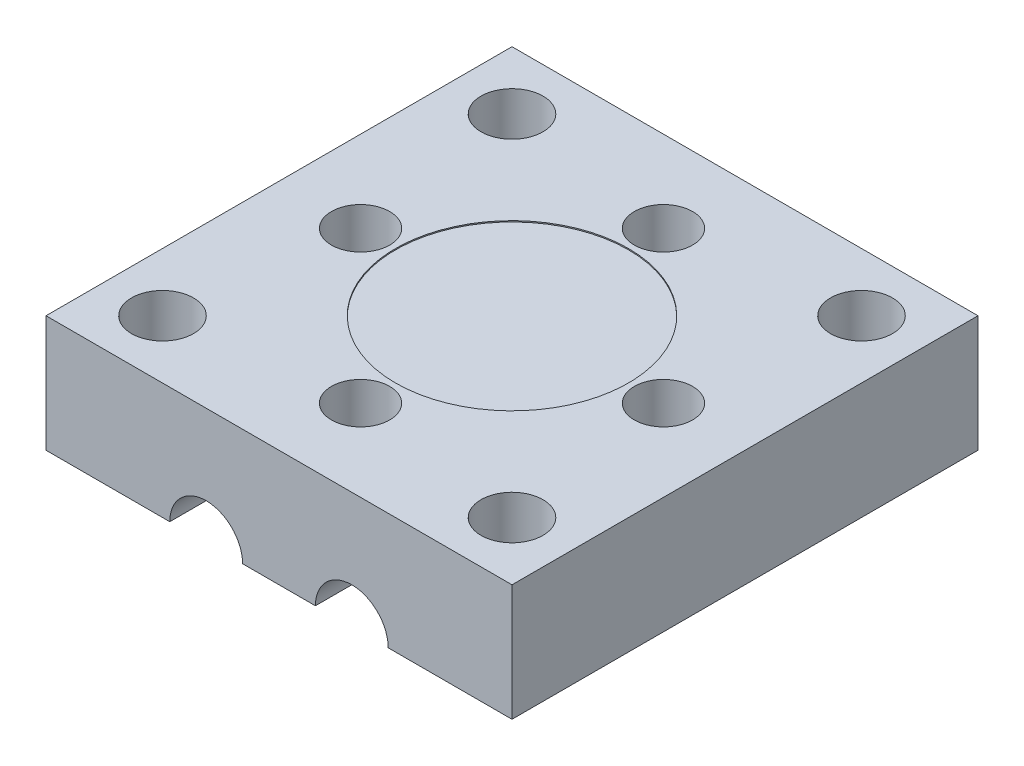
ISO-10303-21;
HEADER;
FILE_DESCRIPTION(('STEP AP214'),'2;1');
FILE_NAME('part.step','',(''),(''),'','','');
FILE_SCHEMA(('AUTOMOTIVE_DESIGN { 1 0 10303 214 1 1 1 1 }'));
ENDSEC;
DATA;
#1=APPLICATION_CONTEXT('core data for automotive mechanical design processes');
#2=APPLICATION_PROTOCOL_DEFINITION('international standard','automotive_design',2000,#1);
#3=PRODUCT_CONTEXT('',#1,'mechanical');
#4=PRODUCT('Part','Part','',(#3));
#5=PRODUCT_RELATED_PRODUCT_CATEGORY('part','',(#4));
#6=PRODUCT_DEFINITION_FORMATION('','',#4);
#7=PRODUCT_DEFINITION_CONTEXT('part definition',#1,'design');
#8=PRODUCT_DEFINITION('design','',#6,#7);
#9=PRODUCT_DEFINITION_SHAPE('','',#8);
#10=(LENGTH_UNIT() NAMED_UNIT(*) SI_UNIT(.MILLI.,.METRE.));
#11=(NAMED_UNIT(*) PLANE_ANGLE_UNIT() SI_UNIT($,.RADIAN.));
#12=(NAMED_UNIT(*) SI_UNIT($,.STERADIAN.) SOLID_ANGLE_UNIT());
#13=UNCERTAINTY_MEASURE_WITH_UNIT(LENGTH_MEASURE(1.E-05),#10,'distance_accuracy_value','');
#14=(GEOMETRIC_REPRESENTATION_CONTEXT(3) GLOBAL_UNCERTAINTY_ASSIGNED_CONTEXT((#13)) GLOBAL_UNIT_ASSIGNED_CONTEXT((#10,
#11,#12)) REPRESENTATION_CONTEXT('',''));
#15=CARTESIAN_POINT('',(0.,0.,0.));
#16=DIRECTION('',(0.,0.,1.));
#17=DIRECTION('',(1.,0.,0.));
#18=AXIS2_PLACEMENT_3D('',#15,#16,#17);
#19=CARTESIAN_POINT('',(-16.51,6.35,0.));
#20=DIRECTION('',(0.,1.,0.));
#21=DIRECTION('',(0.,0.,1.));
#22=AXIS2_PLACEMENT_3D('',#19,#20,#21);
#23=CYLINDRICAL_SURFACE('',#22,1.89865);
#24=CARTESIAN_POINT('',(-16.51,6.35,0.));
#25=DIRECTION('',(0.,1.,0.));
#26=DIRECTION('',(0.,0.,1.));
#27=AXIS2_PLACEMENT_3D('',#24,#25,#26);
#28=CIRCLE('',#27,1.89865);
#29=CARTESIAN_POINT('',(-16.51,6.35,1.89865));
#30=VERTEX_POINT('',#29);
#31=EDGE_CURVE('E157',#30,#30,#28,.T.);
#32=ORIENTED_EDGE('',*,*,#31,.T.);
#33=EDGE_LOOP('',(#32));
#34=FACE_BOUND('',#33,.T.);
#35=CARTESIAN_POINT('',(-16.51,1.5875,0.));
#36=DIRECTION('',(0.,-1.,0.));
#37=DIRECTION('',(0.,0.,-1.));
#38=AXIS2_PLACEMENT_3D('',#35,#36,#37);
#39=CIRCLE('',#38,1.89865);
#40=CARTESIAN_POINT('',(-16.51,1.5875,-1.89865));
#41=VERTEX_POINT('',#40);
#42=EDGE_CURVE('E38',#41,#41,#39,.F.);
#43=ORIENTED_EDGE('',*,*,#42,.F.);
#44=EDGE_LOOP('',(#43));
#45=FACE_BOUND('',#44,.T.);
#46=ADVANCED_FACE('F34',(#34,#45),#23,.F.);
#47=CARTESIAN_POINT('',(0.,6.35,-16.51));
#48=DIRECTION('',(0.,1.,0.));
#49=DIRECTION('',(0.,0.,1.));
#50=AXIS2_PLACEMENT_3D('',#47,#48,#49);
#51=CYLINDRICAL_SURFACE('',#50,1.89865);
#52=CARTESIAN_POINT('',(0.,6.35,-16.51));
#53=DIRECTION('',(0.,1.,0.));
#54=DIRECTION('',(0.,0.,1.));
#55=AXIS2_PLACEMENT_3D('',#52,#53,#54);
#56=CIRCLE('',#55,1.89865);
#57=CARTESIAN_POINT('',(0.,6.35,-14.61135));
#58=VERTEX_POINT('',#57);
#59=EDGE_CURVE('E190',#58,#58,#56,.T.);
#60=ORIENTED_EDGE('',*,*,#59,.T.);
#61=EDGE_LOOP('',(#60));
#62=FACE_BOUND('',#61,.T.);
#63=CARTESIAN_POINT('',(0.,1.5875,-16.51));
#64=DIRECTION('',(0.,-1.,0.));
#65=DIRECTION('',(0.,0.,-1.));
#66=AXIS2_PLACEMENT_3D('',#63,#64,#65);
#67=CIRCLE('',#66,1.89865);
#68=CARTESIAN_POINT('',(0.,1.5875,-18.40865));
#69=VERTEX_POINT('',#68);
#70=EDGE_CURVE('E163',#69,#69,#67,.F.);
#71=ORIENTED_EDGE('',*,*,#70,.F.);
#72=EDGE_LOOP('',(#71));
#73=FACE_BOUND('',#72,.T.);
#74=ADVANCED_FACE('F290',(#62,#73),#51,.F.);
#75=CARTESIAN_POINT('',(16.51,6.35,0.));
#76=DIRECTION('',(0.,1.,0.));
#77=DIRECTION('',(0.,0.,1.));
#78=AXIS2_PLACEMENT_3D('',#75,#76,#77);
#79=CYLINDRICAL_SURFACE('',#78,1.89865);
#80=CARTESIAN_POINT('',(16.51,6.35,0.));
#81=DIRECTION('',(0.,1.,0.));
#82=DIRECTION('',(0.,0.,1.));
#83=AXIS2_PLACEMENT_3D('',#80,#81,#82);
#84=CIRCLE('',#83,1.89865);
#85=CARTESIAN_POINT('',(16.51,6.35,1.89865));
#86=VERTEX_POINT('',#85);
#87=EDGE_CURVE('E193',#86,#86,#84,.T.);
#88=ORIENTED_EDGE('',*,*,#87,.T.);
#89=EDGE_LOOP('',(#88));
#90=FACE_BOUND('',#89,.T.);
#91=CARTESIAN_POINT('',(16.51,1.5875,0.));
#92=DIRECTION('',(0.,-1.,0.));
#93=DIRECTION('',(0.,0.,-1.));
#94=AXIS2_PLACEMENT_3D('',#91,#92,#93);
#95=CIRCLE('',#94,1.89865);
#96=CARTESIAN_POINT('',(16.51,1.5875,-1.89865));
#97=VERTEX_POINT('',#96);
#98=EDGE_CURVE('E159',#97,#97,#95,.F.);
#99=ORIENTED_EDGE('',*,*,#98,.F.);
#100=EDGE_LOOP('',(#99));
#101=FACE_BOUND('',#100,.T.);
#102=ADVANCED_FACE('F296',(#90,#101),#79,.F.);
#103=CARTESIAN_POINT('',(0.,6.35,16.51));
#104=DIRECTION('',(0.,1.,0.));
#105=DIRECTION('',(0.,0.,1.));
#106=AXIS2_PLACEMENT_3D('',#103,#104,#105);
#107=CYLINDRICAL_SURFACE('',#106,1.89865);
#108=CARTESIAN_POINT('',(0.,6.35,16.51));
#109=DIRECTION('',(0.,1.,0.));
#110=DIRECTION('',(0.,0.,1.));
#111=AXIS2_PLACEMENT_3D('',#108,#109,#110);
#112=CIRCLE('',#111,1.89865);
#113=CARTESIAN_POINT('',(0.,6.35,18.40865));
#114=VERTEX_POINT('',#113);
#115=EDGE_CURVE('E196',#114,#114,#112,.T.);
#116=ORIENTED_EDGE('',*,*,#115,.T.);
#117=EDGE_LOOP('',(#116));
#118=FACE_BOUND('',#117,.T.);
#119=CARTESIAN_POINT('',(0.,1.5875,16.51));
#120=DIRECTION('',(0.,-1.,0.));
#121=DIRECTION('',(0.,0.,-1.));
#122=AXIS2_PLACEMENT_3D('',#119,#120,#121);
#123=CIRCLE('',#122,1.89865);
#124=CARTESIAN_POINT('',(0.,1.5875,14.61135));
#125=VERTEX_POINT('',#124);
#126=EDGE_CURVE('E154',#125,#125,#123,.F.);
#127=ORIENTED_EDGE('',*,*,#126,.F.);
#128=EDGE_LOOP('',(#127));
#129=FACE_BOUND('',#128,.T.);
#130=ADVANCED_FACE('F281',(#118,#129),#107,.F.);
#131=CARTESIAN_POINT('',(0.,0.,0.));
#132=DIRECTION('',(0.,1.,0.));
#133=DIRECTION('',(0.,0.,1.));
#134=AXIS2_PLACEMENT_3D('',#131,#132,#133);
#135=PLANE('',#134);
#136=CARTESIAN_POINT('',(0.,0.,-16.51));
#137=DIRECTION('',(0.,-1.,0.));
#138=DIRECTION('',(0.,0.,-1.));
#139=AXIS2_PLACEMENT_3D('',#136,#137,#138);
#140=CIRCLE('',#139,3.175);
#141=CARTESIAN_POINT('',(0.,0.,-19.685));
#142=VERTEX_POINT('',#141);
#143=EDGE_CURVE('E172',#142,#142,#140,.T.);
#144=ORIENTED_EDGE('',*,*,#143,.F.);
#145=EDGE_LOOP('',(#144));
#146=FACE_BOUND('',#145,.T.);
#147=CARTESIAN_POINT('',(0.,0.,16.51));
#148=DIRECTION('',(0.,-1.,0.));
#149=DIRECTION('',(0.,0.,-1.));
#150=AXIS2_PLACEMENT_3D('',#147,#148,#149);
#151=CIRCLE('',#150,3.175);
#152=CARTESIAN_POINT('',(0.,0.,13.335));
#153=VERTEX_POINT('',#152);
#154=EDGE_CURVE('E161',#153,#153,#151,.T.);
#155=ORIENTED_EDGE('',*,*,#154,.F.);
#156=EDGE_LOOP('',(#155));
#157=FACE_BOUND('',#156,.T.);
#158=DIRECTION('',(-1.,0.,0.));
#159=VECTOR('',#158,1.);
#160=CARTESIAN_POINT('',(-25.4,0.,-25.4));
#161=LINE('',#160,#159);
#162=CARTESIAN_POINT('',(3.96875,0.,-25.4));
#163=VERTEX_POINT('',#162);
#164=CARTESIAN_POINT('',(-3.96875,0.,-25.4));
#165=VERTEX_POINT('',#164);
#166=EDGE_CURVE('E58',#163,#165,#161,.T.);
#167=ORIENTED_EDGE('',*,*,#166,.F.);
#168=DIRECTION('',(0.,0.,1.));
#169=VECTOR('',#168,1.);
#170=CARTESIAN_POINT('',(3.96875,0.,-25.4));
#171=LINE('',#170,#169);
#172=CARTESIAN_POINT('',(3.96875,0.,25.4));
#173=VERTEX_POINT('',#172);
#174=EDGE_CURVE('E11',#163,#173,#171,.T.);
#175=ORIENTED_EDGE('',*,*,#174,.T.);
#176=DIRECTION('',(1.,0.,0.));
#177=VECTOR('',#176,1.);
#178=CARTESIAN_POINT('',(-25.4,0.,25.4));
#179=LINE('',#178,#177);
#180=CARTESIAN_POINT('',(-3.96875,0.,25.4));
#181=VERTEX_POINT('',#180);
#182=EDGE_CURVE('E116',#181,#173,#179,.T.);
#183=ORIENTED_EDGE('',*,*,#182,.F.);
#184=DIRECTION('',(0.,0.,1.));
#185=VECTOR('',#184,1.);
#186=CARTESIAN_POINT('',(-3.96875,0.,-25.4));
#187=LINE('',#186,#185);
#188=EDGE_CURVE('E149',#181,#165,#187,.F.);
#189=ORIENTED_EDGE('',*,*,#188,.T.);
#190=EDGE_LOOP('',(#167,#175,#183,#189));
#191=FACE_BOUND('',#190,.T.);
#192=ADVANCED_FACE('F269',(#146,#157,#191),#135,.F.);
#193=CARTESIAN_POINT('',(-16.51,0.,0.));
#194=DIRECTION('',(0.,-1.,0.));
#195=DIRECTION('',(0.,0.,-1.));
#196=AXIS2_PLACEMENT_3D('',#193,#194,#195);
#197=CIRCLE('',#196,3.175);
#198=CARTESIAN_POINT('',(-16.51,0.,-3.175));
#199=VERTEX_POINT('',#198);
#200=EDGE_CURVE('E179',#199,#199,#197,.T.);
#201=ORIENTED_EDGE('',*,*,#200,.F.);
#202=EDGE_LOOP('',(#201));
#203=FACE_BOUND('',#202,.T.);
#204=CARTESIAN_POINT('',(-19.05,0.,19.05));
#205=DIRECTION('',(0.,1.,0.));
#206=DIRECTION('',(0.,0.,1.));
#207=AXIS2_PLACEMENT_3D('',#204,#205,#206);
#208=CIRCLE('',#207,3.37819999999999);
#209=CARTESIAN_POINT('',(-19.05,0.,22.4282));
#210=VERTEX_POINT('',#209);
#211=EDGE_CURVE('E226',#210,#210,#208,.T.);
#212=ORIENTED_EDGE('',*,*,#211,.T.);
#213=EDGE_LOOP('',(#212));
#214=FACE_BOUND('',#213,.T.);
#215=CARTESIAN_POINT('',(-19.05,0.,-19.05));
#216=DIRECTION('',(0.,1.,0.));
#217=DIRECTION('',(0.,0.,1.));
#218=AXIS2_PLACEMENT_3D('',#215,#216,#217);
#219=CIRCLE('',#218,3.37819999999999);
#220=CARTESIAN_POINT('',(-19.05,0.,-15.6718));
#221=VERTEX_POINT('',#220);
#222=EDGE_CURVE('E232',#221,#221,#219,.T.);
#223=ORIENTED_EDGE('',*,*,#222,.T.);
#224=EDGE_LOOP('',(#223));
#225=FACE_BOUND('',#224,.T.);
#226=CARTESIAN_POINT('',(-11.90625,0.,-25.4));
#227=VERTEX_POINT('',#226);
#228=CARTESIAN_POINT('',(-25.4,0.,-25.4));
#229=VERTEX_POINT('',#228);
#230=EDGE_CURVE('E131',#227,#229,#161,.T.);
#231=ORIENTED_EDGE('',*,*,#230,.F.);
#232=DIRECTION('',(0.,0.,1.));
#233=VECTOR('',#232,1.);
#234=CARTESIAN_POINT('',(-11.90625,0.,-25.4));
#235=LINE('',#234,#233);
#236=CARTESIAN_POINT('',(-11.90625,0.,25.4));
#237=VERTEX_POINT('',#236);
#238=EDGE_CURVE('E106',#227,#237,#235,.T.);
#239=ORIENTED_EDGE('',*,*,#238,.T.);
#240=CARTESIAN_POINT('',(-25.4,0.,25.4));
#241=VERTEX_POINT('',#240);
#242=EDGE_CURVE('E124',#241,#237,#179,.T.);
#243=ORIENTED_EDGE('',*,*,#242,.F.);
#244=DIRECTION('',(0.,0.,1.));
#245=VECTOR('',#244,1.);
#246=CARTESIAN_POINT('',(-25.4,0.,-25.4));
#247=LINE('',#246,#245);
#248=EDGE_CURVE('E122',#229,#241,#247,.T.);
#249=ORIENTED_EDGE('',*,*,#248,.F.);
#250=EDGE_LOOP('',(#231,#239,#243,#249));
#251=FACE_BOUND('',#250,.T.);
#252=ADVANCED_FACE('F273',(#203,#214,#225,#251),#135,.F.);
#253=CARTESIAN_POINT('',(-25.4,12.7,-25.4));
#254=DIRECTION('',(1.,0.,0.));
#255=DIRECTION('',(0.,0.,-1.));
#256=AXIS2_PLACEMENT_3D('',#253,#254,#255);
#257=PLANE('',#256);
#258=ORIENTED_EDGE('',*,*,#248,.T.);
#259=DIRECTION('',(0.,-1.,0.));
#260=VECTOR('',#259,1.);
#261=CARTESIAN_POINT('',(-25.4,12.7,25.4));
#262=LINE('',#261,#260);
#263=CARTESIAN_POINT('',(-25.4,12.7,25.4));
#264=VERTEX_POINT('',#263);
#265=EDGE_CURVE('E147',#264,#241,#262,.T.);
#266=ORIENTED_EDGE('',*,*,#265,.F.);
#267=DIRECTION('',(0.,0.,1.));
#268=VECTOR('',#267,1.);
#269=CARTESIAN_POINT('',(-25.4,12.7,-25.4));
#270=LINE('',#269,#268);
#271=CARTESIAN_POINT('',(-25.4,12.7,-25.4));
#272=VERTEX_POINT('',#271);
#273=EDGE_CURVE('E138',#272,#264,#270,.T.);
#274=ORIENTED_EDGE('',*,*,#273,.F.);
#275=DIRECTION('',(0.,-1.,0.));
#276=VECTOR('',#275,1.);
#277=CARTESIAN_POINT('',(-25.4,12.7,-25.4));
#278=LINE('',#277,#276);
#279=EDGE_CURVE('E139',#272,#229,#278,.T.);
#280=ORIENTED_EDGE('',*,*,#279,.T.);
#281=EDGE_LOOP('',(#258,#266,#274,#280));
#282=FACE_BOUND('',#281,.T.);
#283=ADVANCED_FACE('F36',(#282),#257,.F.);
#284=CARTESIAN_POINT('',(-25.4,12.7,25.4));
#285=DIRECTION('',(0.,0.,-1.));
#286=DIRECTION('',(-1.,0.,0.));
#287=AXIS2_PLACEMENT_3D('',#284,#285,#286);
#288=PLANE('',#287);
#289=ORIENTED_EDGE('',*,*,#182,.T.);
#290=CARTESIAN_POINT('',(7.9375,0.,25.4));
#291=DIRECTION('',(0.,0.,1.));
#292=DIRECTION('',(1.,0.,0.));
#293=AXIS2_PLACEMENT_3D('',#290,#291,#292);
#294=CIRCLE('',#293,3.96875);
#295=CARTESIAN_POINT('',(11.90625,0.,25.4));
#296=VERTEX_POINT('',#295);
#297=EDGE_CURVE('E101',#296,#173,#294,.T.);
#298=ORIENTED_EDGE('',*,*,#297,.F.);
#299=CARTESIAN_POINT('',(25.4,0.,25.4));
#300=VERTEX_POINT('',#299);
#301=EDGE_CURVE('E112',#296,#300,#179,.T.);
#302=ORIENTED_EDGE('',*,*,#301,.T.);
#303=DIRECTION('',(0.,-1.,0.));
#304=VECTOR('',#303,1.);
#305=CARTESIAN_POINT('',(25.4,12.7,25.4));
#306=LINE('',#305,#304);
#307=CARTESIAN_POINT('',(25.4,12.7,25.4));
#308=VERTEX_POINT('',#307);
#309=EDGE_CURVE('E145',#308,#300,#306,.T.);
#310=ORIENTED_EDGE('',*,*,#309,.F.);
#311=DIRECTION('',(1.,0.,0.));
#312=VECTOR('',#311,1.);
#313=CARTESIAN_POINT('',(-25.4,12.7,25.4));
#314=LINE('',#313,#312);
#315=EDGE_CURVE('E252',#264,#308,#314,.T.);
#316=ORIENTED_EDGE('',*,*,#315,.F.);
#317=ORIENTED_EDGE('',*,*,#265,.T.);
#318=ORIENTED_EDGE('',*,*,#242,.T.);
#319=CARTESIAN_POINT('',(-7.9375,0.,25.4));
#320=DIRECTION('',(0.,0.,1.));
#321=DIRECTION('',(1.,0.,0.));
#322=AXIS2_PLACEMENT_3D('',#319,#320,#321);
#323=CIRCLE('',#322,3.96875);
#324=EDGE_CURVE('E246',#181,#237,#323,.T.);
#325=ORIENTED_EDGE('',*,*,#324,.F.);
#326=EDGE_LOOP('',(#289,#298,#302,#310,#316,#317,#318,#325));
#327=FACE_BOUND('',#326,.T.);
#328=ADVANCED_FACE('F110',(#327),#288,.F.);
#329=CARTESIAN_POINT('',(25.4,12.7,-25.4));
#330=DIRECTION('',(-1.,0.,0.));
#331=DIRECTION('',(0.,0.,1.));
#332=AXIS2_PLACEMENT_3D('',#329,#330,#331);
#333=PLANE('',#332);
#334=DIRECTION('',(0.,0.,-1.));
#335=VECTOR('',#334,1.);
#336=CARTESIAN_POINT('',(25.4,0.,-25.4));
#337=LINE('',#336,#335);
#338=CARTESIAN_POINT('',(25.4,0.,-25.4));
#339=VERTEX_POINT('',#338);
#340=EDGE_CURVE('E121',#300,#339,#337,.T.);
#341=ORIENTED_EDGE('',*,*,#340,.T.);
#342=DIRECTION('',(0.,-1.,0.));
#343=VECTOR('',#342,1.);
#344=CARTESIAN_POINT('',(25.4,12.7,-25.4));
#345=LINE('',#344,#343);
#346=CARTESIAN_POINT('',(25.4,12.7,-25.4));
#347=VERTEX_POINT('',#346);
#348=EDGE_CURVE('E142',#347,#339,#345,.T.);
#349=ORIENTED_EDGE('',*,*,#348,.F.);
#350=DIRECTION('',(0.,0.,-1.));
#351=VECTOR('',#350,1.);
#352=CARTESIAN_POINT('',(25.4,12.7,-25.4));
#353=LINE('',#352,#351);
#354=EDGE_CURVE('E254',#308,#347,#353,.T.);
#355=ORIENTED_EDGE('',*,*,#354,.F.);
#356=ORIENTED_EDGE('',*,*,#309,.T.);
#357=EDGE_LOOP('',(#341,#349,#355,#356));
#358=FACE_BOUND('',#357,.T.);
#359=ADVANCED_FACE('F267',(#358),#333,.F.);
#360=CARTESIAN_POINT('',(-25.4,12.7,-25.4));
#361=DIRECTION('',(0.,0.,1.));
#362=DIRECTION('',(1.,0.,0.));
#363=AXIS2_PLACEMENT_3D('',#360,#361,#362);
#364=PLANE('',#363);
#365=CARTESIAN_POINT('',(11.90625,0.,-25.4));
#366=VERTEX_POINT('',#365);
#367=EDGE_CURVE('E136',#339,#366,#161,.T.);
#368=ORIENTED_EDGE('',*,*,#367,.T.);
#369=CARTESIAN_POINT('',(7.9375,0.,-25.4));
#370=DIRECTION('',(0.,0.,1.));
#371=DIRECTION('',(1.,0.,0.));
#372=AXIS2_PLACEMENT_3D('',#369,#370,#371);
#373=CIRCLE('',#372,3.96875);
#374=EDGE_CURVE('E51',#366,#163,#373,.T.);
#375=ORIENTED_EDGE('',*,*,#374,.T.);
#376=ORIENTED_EDGE('',*,*,#166,.T.);
#377=CARTESIAN_POINT('',(-7.9375,0.,-25.4));
#378=DIRECTION('',(0.,0.,1.));
#379=DIRECTION('',(1.,0.,0.));
#380=AXIS2_PLACEMENT_3D('',#377,#378,#379);
#381=CIRCLE('',#380,3.96875);
#382=EDGE_CURVE('E126',#165,#227,#381,.T.);
#383=ORIENTED_EDGE('',*,*,#382,.T.);
#384=ORIENTED_EDGE('',*,*,#230,.T.);
#385=ORIENTED_EDGE('',*,*,#279,.F.);
#386=DIRECTION('',(-1.,0.,0.));
#387=VECTOR('',#386,1.);
#388=CARTESIAN_POINT('',(-25.4,12.7,-25.4));
#389=LINE('',#388,#387);
#390=EDGE_CURVE('E143',#347,#272,#389,.T.);
#391=ORIENTED_EDGE('',*,*,#390,.F.);
#392=ORIENTED_EDGE('',*,*,#348,.T.);
#393=EDGE_LOOP('',(#368,#375,#376,#383,#384,#385,#391,#392));
#394=FACE_BOUND('',#393,.T.);
#395=ADVANCED_FACE('F263',(#394),#364,.F.);
#396=CARTESIAN_POINT('',(0.,12.7,0.));
#397=DIRECTION('',(0.,1.,0.));
#398=DIRECTION('',(0.,0.,1.));
#399=AXIS2_PLACEMENT_3D('',#396,#397,#398);
#400=PLANE('',#399);
#401=CARTESIAN_POINT('',(0.,12.7,0.));
#402=DIRECTION('',(0.,1.,0.));
#403=DIRECTION('',(0.,0.,1.));
#404=AXIS2_PLACEMENT_3D('',#401,#402,#403);
#405=CIRCLE('',#404,12.7);
#406=CARTESIAN_POINT('',(0.,12.7,12.7));
#407=VERTEX_POINT('',#406);
#408=EDGE_CURVE('E372',#407,#407,#405,.T.);
#409=ORIENTED_EDGE('',*,*,#408,.F.);
#410=EDGE_LOOP('',(#409));
#411=FACE_BOUND('',#410,.T.);
#412=CARTESIAN_POINT('',(0.,12.7,16.51));
#413=DIRECTION('',(0.,1.,0.));
#414=DIRECTION('',(0.,0.,1.));
#415=AXIS2_PLACEMENT_3D('',#412,#413,#414);
#416=CIRCLE('',#415,3.175);
#417=CARTESIAN_POINT('',(0.,12.7,19.685));
#418=VERTEX_POINT('',#417);
#419=EDGE_CURVE('E199',#418,#418,#416,.T.);
#420=ORIENTED_EDGE('',*,*,#419,.F.);
#421=EDGE_LOOP('',(#420));
#422=FACE_BOUND('',#421,.T.);
#423=CARTESIAN_POINT('',(16.51,12.7,0.));
#424=DIRECTION('',(0.,1.,0.));
#425=DIRECTION('',(0.,0.,1.));
#426=AXIS2_PLACEMENT_3D('',#423,#424,#425);
#427=CIRCLE('',#426,3.175);
#428=CARTESIAN_POINT('',(16.51,12.7,3.175));
#429=VERTEX_POINT('',#428);
#430=EDGE_CURVE('E203',#429,#429,#427,.T.);
#431=ORIENTED_EDGE('',*,*,#430,.F.);
#432=EDGE_LOOP('',(#431));
#433=FACE_BOUND('',#432,.T.);
#434=CARTESIAN_POINT('',(0.,12.7,-16.51));
#435=DIRECTION('',(0.,1.,0.));
#436=DIRECTION('',(0.,0.,1.));
#437=AXIS2_PLACEMENT_3D('',#434,#435,#436);
#438=CIRCLE('',#437,3.175);
#439=CARTESIAN_POINT('',(0.,12.7,-13.335));
#440=VERTEX_POINT('',#439);
#441=EDGE_CURVE('E209',#440,#440,#438,.T.);
#442=ORIENTED_EDGE('',*,*,#441,.F.);
#443=EDGE_LOOP('',(#442));
#444=FACE_BOUND('',#443,.T.);
#445=CARTESIAN_POINT('',(-16.51,12.7,0.));
#446=DIRECTION('',(0.,1.,0.));
#447=DIRECTION('',(0.,0.,1.));
#448=AXIS2_PLACEMENT_3D('',#445,#446,#447);
#449=CIRCLE('',#448,3.175);
#450=CARTESIAN_POINT('',(-16.51,12.7,3.175));
#451=VERTEX_POINT('',#450);
#452=EDGE_CURVE('E215',#451,#451,#449,.T.);
#453=ORIENTED_EDGE('',*,*,#452,.F.);
#454=EDGE_LOOP('',(#453));
#455=FACE_BOUND('',#454,.T.);
#456=CARTESIAN_POINT('',(-19.05,12.7,19.05));
#457=DIRECTION('',(0.,1.,0.));
#458=DIRECTION('',(0.,0.,1.));
#459=AXIS2_PLACEMENT_3D('',#456,#457,#458);
#460=CIRCLE('',#459,3.3782);
#461=CARTESIAN_POINT('',(-19.05,12.7,22.4282));
#462=VERTEX_POINT('',#461);
#463=EDGE_CURVE('E221',#462,#462,#460,.T.);
#464=ORIENTED_EDGE('',*,*,#463,.F.);
#465=EDGE_LOOP('',(#464));
#466=FACE_BOUND('',#465,.T.);
#467=CARTESIAN_POINT('',(-19.05,12.7,-19.05));
#468=DIRECTION('',(0.,1.,0.));
#469=DIRECTION('',(0.,0.,1.));
#470=AXIS2_PLACEMENT_3D('',#467,#468,#469);
#471=CIRCLE('',#470,3.3782);
#472=CARTESIAN_POINT('',(-19.05,12.7,-15.6718));
#473=VERTEX_POINT('',#472);
#474=EDGE_CURVE('E229',#473,#473,#471,.T.);
#475=ORIENTED_EDGE('',*,*,#474,.F.);
#476=EDGE_LOOP('',(#475));
#477=FACE_BOUND('',#476,.T.);
#478=CARTESIAN_POINT('',(19.05,12.7,-19.05));
#479=DIRECTION('',(0.,1.,0.));
#480=DIRECTION('',(0.,0.,1.));
#481=AXIS2_PLACEMENT_3D('',#478,#479,#480);
#482=CIRCLE('',#481,3.3782);
#483=CARTESIAN_POINT('',(19.05,12.7,-15.6718));
#484=VERTEX_POINT('',#483);
#485=EDGE_CURVE('E235',#484,#484,#482,.T.);
#486=ORIENTED_EDGE('',*,*,#485,.F.);
#487=EDGE_LOOP('',(#486));
#488=FACE_BOUND('',#487,.T.);
#489=CARTESIAN_POINT('',(19.05,12.7,19.05));
#490=DIRECTION('',(0.,1.,0.));
#491=DIRECTION('',(0.,0.,1.));
#492=AXIS2_PLACEMENT_3D('',#489,#490,#491);
#493=CIRCLE('',#492,3.3782);
#494=CARTESIAN_POINT('',(19.05,12.7,22.4282));
#495=VERTEX_POINT('',#494);
#496=EDGE_CURVE('E241',#495,#495,#493,.T.);
#497=ORIENTED_EDGE('',*,*,#496,.F.);
#498=EDGE_LOOP('',(#497));
#499=FACE_BOUND('',#498,.T.);
#500=ORIENTED_EDGE('',*,*,#273,.T.);
#501=ORIENTED_EDGE('',*,*,#315,.T.);
#502=ORIENTED_EDGE('',*,*,#354,.T.);
#503=ORIENTED_EDGE('',*,*,#390,.T.);
#504=EDGE_LOOP('',(#500,#501,#502,#503));
#505=FACE_BOUND('',#504,.T.);
#506=ADVANCED_FACE('F259',(#411,#422,#433,#444,#455,#466,#477,#488,#499,#505),#400,.T.);
#507=CARTESIAN_POINT('',(16.51,0.,0.));
#508=DIRECTION('',(0.,-1.,0.));
#509=DIRECTION('',(0.,0.,-1.));
#510=AXIS2_PLACEMENT_3D('',#507,#508,#509);
#511=CIRCLE('',#510,3.175);
#512=CARTESIAN_POINT('',(16.51,0.,-3.175));
#513=VERTEX_POINT('',#512);
#514=EDGE_CURVE('E165',#513,#513,#511,.T.);
#515=ORIENTED_EDGE('',*,*,#514,.F.);
#516=EDGE_LOOP('',(#515));
#517=FACE_BOUND('',#516,.T.);
#518=CARTESIAN_POINT('',(19.05,0.,-19.05));
#519=DIRECTION('',(0.,1.,0.));
#520=DIRECTION('',(0.,0.,1.));
#521=AXIS2_PLACEMENT_3D('',#518,#519,#520);
#522=CIRCLE('',#521,3.37819999999999);
#523=CARTESIAN_POINT('',(19.05,0.,-15.6718));
#524=VERTEX_POINT('',#523);
#525=EDGE_CURVE('E238',#524,#524,#522,.T.);
#526=ORIENTED_EDGE('',*,*,#525,.T.);
#527=EDGE_LOOP('',(#526));
#528=FACE_BOUND('',#527,.T.);
#529=CARTESIAN_POINT('',(19.05,0.,19.05));
#530=DIRECTION('',(0.,1.,0.));
#531=DIRECTION('',(0.,0.,1.));
#532=AXIS2_PLACEMENT_3D('',#529,#530,#531);
#533=CIRCLE('',#532,3.37819999999999);
#534=CARTESIAN_POINT('',(19.05,0.,22.4282));
#535=VERTEX_POINT('',#534);
#536=EDGE_CURVE('E117',#535,#535,#533,.T.);
#537=ORIENTED_EDGE('',*,*,#536,.T.);
#538=EDGE_LOOP('',(#537));
#539=FACE_BOUND('',#538,.T.);
#540=ORIENTED_EDGE('',*,*,#301,.F.);
#541=DIRECTION('',(0.,0.,1.));
#542=VECTOR('',#541,1.);
#543=CARTESIAN_POINT('',(11.90625,0.,-25.4));
#544=LINE('',#543,#542);
#545=EDGE_CURVE('E43',#296,#366,#544,.F.);
#546=ORIENTED_EDGE('',*,*,#545,.T.);
#547=ORIENTED_EDGE('',*,*,#367,.F.);
#548=ORIENTED_EDGE('',*,*,#340,.F.);
#549=EDGE_LOOP('',(#540,#546,#547,#548));
#550=FACE_BOUND('',#549,.T.);
#551=ADVANCED_FACE('F120',(#517,#528,#539,#550),#135,.F.);
#552=CARTESIAN_POINT('',(-7.9375,0.,-25.4));
#553=DIRECTION('',(0.,0.,1.));
#554=DIRECTION('',(1.,0.,0.));
#555=AXIS2_PLACEMENT_3D('',#552,#553,#554);
#556=CYLINDRICAL_SURFACE('',#555,3.96875);
#557=ORIENTED_EDGE('',*,*,#382,.F.);
#558=ORIENTED_EDGE('',*,*,#188,.F.);
#559=ORIENTED_EDGE('',*,*,#324,.T.);
#560=ORIENTED_EDGE('',*,*,#238,.F.);
#561=EDGE_LOOP('',(#557,#558,#559,#560));
#562=FACE_BOUND('',#561,.T.);
#563=ADVANCED_FACE('F271',(#562),#556,.F.);
#564=CARTESIAN_POINT('',(7.9375,0.,-25.4));
#565=DIRECTION('',(0.,0.,1.));
#566=DIRECTION('',(1.,0.,0.));
#567=AXIS2_PLACEMENT_3D('',#564,#565,#566);
#568=CYLINDRICAL_SURFACE('',#567,3.96875);
#569=ORIENTED_EDGE('',*,*,#374,.F.);
#570=ORIENTED_EDGE('',*,*,#545,.F.);
#571=ORIENTED_EDGE('',*,*,#297,.T.);
#572=ORIENTED_EDGE('',*,*,#174,.F.);
#573=EDGE_LOOP('',(#569,#570,#571,#572));
#574=FACE_BOUND('',#573,.T.);
#575=ADVANCED_FACE('F100',(#574),#568,.F.);
#576=CARTESIAN_POINT('',(19.05,12.7,19.05));
#577=DIRECTION('',(0.,1.,0.));
#578=DIRECTION('',(0.,0.,1.));
#579=AXIS2_PLACEMENT_3D('',#576,#577,#578);
#580=CYLINDRICAL_SURFACE('',#579,3.3782);
#581=ORIENTED_EDGE('',*,*,#536,.F.);
#582=EDGE_LOOP('',(#581));
#583=FACE_BOUND('',#582,.T.);
#584=ORIENTED_EDGE('',*,*,#496,.T.);
#585=EDGE_LOOP('',(#584));
#586=FACE_BOUND('',#585,.T.);
#587=ADVANCED_FACE('F354',(#583,#586),#580,.F.);
#588=CARTESIAN_POINT('',(19.05,12.7,-19.05));
#589=DIRECTION('',(0.,1.,0.));
#590=DIRECTION('',(0.,0.,1.));
#591=AXIS2_PLACEMENT_3D('',#588,#589,#590);
#592=CYLINDRICAL_SURFACE('',#591,3.3782);
#593=ORIENTED_EDGE('',*,*,#525,.F.);
#594=EDGE_LOOP('',(#593));
#595=FACE_BOUND('',#594,.T.);
#596=ORIENTED_EDGE('',*,*,#485,.T.);
#597=EDGE_LOOP('',(#596));
#598=FACE_BOUND('',#597,.T.);
#599=ADVANCED_FACE('F350',(#595,#598),#592,.F.);
#600=CARTESIAN_POINT('',(-19.05,12.7,-19.05));
#601=DIRECTION('',(0.,1.,0.));
#602=DIRECTION('',(0.,0.,1.));
#603=AXIS2_PLACEMENT_3D('',#600,#601,#602);
#604=CYLINDRICAL_SURFACE('',#603,3.3782);
#605=ORIENTED_EDGE('',*,*,#222,.F.);
#606=EDGE_LOOP('',(#605));
#607=FACE_BOUND('',#606,.T.);
#608=ORIENTED_EDGE('',*,*,#474,.T.);
#609=EDGE_LOOP('',(#608));
#610=FACE_BOUND('',#609,.T.);
#611=ADVANCED_FACE('F346',(#607,#610),#604,.F.);
#612=CARTESIAN_POINT('',(-19.05,12.7,19.05));
#613=DIRECTION('',(0.,1.,0.));
#614=DIRECTION('',(0.,0.,1.));
#615=AXIS2_PLACEMENT_3D('',#612,#613,#614);
#616=CYLINDRICAL_SURFACE('',#615,3.3782);
#617=ORIENTED_EDGE('',*,*,#211,.F.);
#618=EDGE_LOOP('',(#617));
#619=FACE_BOUND('',#618,.T.);
#620=ORIENTED_EDGE('',*,*,#463,.T.);
#621=EDGE_LOOP('',(#620));
#622=FACE_BOUND('',#621,.T.);
#623=ADVANCED_FACE('F342',(#619,#622),#616,.F.);
#624=CARTESIAN_POINT('',(-16.51,6.35,0.));
#625=DIRECTION('',(0.,1.,0.));
#626=DIRECTION('',(0.,0.,1.));
#627=AXIS2_PLACEMENT_3D('',#624,#625,#626);
#628=CYLINDRICAL_SURFACE('',#627,3.175);
#629=CARTESIAN_POINT('',(-16.51,6.35,0.));
#630=DIRECTION('',(0.,1.,0.));
#631=DIRECTION('',(0.,0.,1.));
#632=AXIS2_PLACEMENT_3D('',#629,#630,#631);
#633=CIRCLE('',#632,3.175);
#634=CARTESIAN_POINT('',(-16.51,6.35,3.175));
#635=VERTEX_POINT('',#634);
#636=EDGE_CURVE('E218',#635,#635,#633,.T.);
#637=ORIENTED_EDGE('',*,*,#636,.F.);
#638=EDGE_LOOP('',(#637));
#639=FACE_BOUND('',#638,.T.);
#640=ORIENTED_EDGE('',*,*,#452,.T.);
#641=EDGE_LOOP('',(#640));
#642=FACE_BOUND('',#641,.T.);
#643=ADVANCED_FACE('F338',(#639,#642),#628,.F.);
#644=CARTESIAN_POINT('',(-16.51,6.35,0.));
#645=DIRECTION('',(0.,1.,0.));
#646=DIRECTION('',(0.,0.,1.));
#647=AXIS2_PLACEMENT_3D('',#644,#645,#646);
#648=PLANE('',#647);
#649=ORIENTED_EDGE('',*,*,#31,.F.);
#650=EDGE_LOOP('',(#649));
#651=FACE_BOUND('',#650,.T.);
#652=ORIENTED_EDGE('',*,*,#636,.T.);
#653=EDGE_LOOP('',(#652));
#654=FACE_BOUND('',#653,.T.);
#655=ADVANCED_FACE('F334',(#651,#654),#648,.T.);
#656=CARTESIAN_POINT('',(0.,6.35,-16.51));
#657=DIRECTION('',(0.,1.,0.));
#658=DIRECTION('',(0.,0.,1.));
#659=AXIS2_PLACEMENT_3D('',#656,#657,#658);
#660=CYLINDRICAL_SURFACE('',#659,3.175);
#661=CARTESIAN_POINT('',(0.,6.35,-16.51));
#662=DIRECTION('',(0.,1.,0.));
#663=DIRECTION('',(0.,0.,1.));
#664=AXIS2_PLACEMENT_3D('',#661,#662,#663);
#665=CIRCLE('',#664,3.175);
#666=CARTESIAN_POINT('',(0.,6.35,-13.335));
#667=VERTEX_POINT('',#666);
#668=EDGE_CURVE('E212',#667,#667,#665,.T.);
#669=ORIENTED_EDGE('',*,*,#668,.F.);
#670=EDGE_LOOP('',(#669));
#671=FACE_BOUND('',#670,.T.);
#672=ORIENTED_EDGE('',*,*,#441,.T.);
#673=EDGE_LOOP('',(#672));
#674=FACE_BOUND('',#673,.T.);
#675=ADVANCED_FACE('F330',(#671,#674),#660,.F.);
#676=CARTESIAN_POINT('',(0.,6.35,-16.51));
#677=DIRECTION('',(0.,1.,0.));
#678=DIRECTION('',(0.,0.,1.));
#679=AXIS2_PLACEMENT_3D('',#676,#677,#678);
#680=PLANE('',#679);
#681=ORIENTED_EDGE('',*,*,#59,.F.);
#682=EDGE_LOOP('',(#681));
#683=FACE_BOUND('',#682,.T.);
#684=ORIENTED_EDGE('',*,*,#668,.T.);
#685=EDGE_LOOP('',(#684));
#686=FACE_BOUND('',#685,.T.);
#687=ADVANCED_FACE('F326',(#683,#686),#680,.T.);
#688=CARTESIAN_POINT('',(16.51,6.35,0.));
#689=DIRECTION('',(0.,1.,0.));
#690=DIRECTION('',(0.,0.,1.));
#691=AXIS2_PLACEMENT_3D('',#688,#689,#690);
#692=CYLINDRICAL_SURFACE('',#691,3.175);
#693=CARTESIAN_POINT('',(16.51,6.35,0.));
#694=DIRECTION('',(0.,1.,0.));
#695=DIRECTION('',(0.,0.,1.));
#696=AXIS2_PLACEMENT_3D('',#693,#694,#695);
#697=CIRCLE('',#696,3.175);
#698=CARTESIAN_POINT('',(16.51,6.35,3.175));
#699=VERTEX_POINT('',#698);
#700=EDGE_CURVE('E206',#699,#699,#697,.T.);
#701=ORIENTED_EDGE('',*,*,#700,.F.);
#702=EDGE_LOOP('',(#701));
#703=FACE_BOUND('',#702,.T.);
#704=ORIENTED_EDGE('',*,*,#430,.T.);
#705=EDGE_LOOP('',(#704));
#706=FACE_BOUND('',#705,.T.);
#707=ADVANCED_FACE('F322',(#703,#706),#692,.F.);
#708=CARTESIAN_POINT('',(16.51,6.35,0.));
#709=DIRECTION('',(0.,1.,0.));
#710=DIRECTION('',(0.,0.,1.));
#711=AXIS2_PLACEMENT_3D('',#708,#709,#710);
#712=PLANE('',#711);
#713=ORIENTED_EDGE('',*,*,#87,.F.);
#714=EDGE_LOOP('',(#713));
#715=FACE_BOUND('',#714,.T.);
#716=ORIENTED_EDGE('',*,*,#700,.T.);
#717=EDGE_LOOP('',(#716));
#718=FACE_BOUND('',#717,.T.);
#719=ADVANCED_FACE('F318',(#715,#718),#712,.T.);
#720=CARTESIAN_POINT('',(0.,6.35,16.51));
#721=DIRECTION('',(0.,1.,0.));
#722=DIRECTION('',(0.,0.,1.));
#723=AXIS2_PLACEMENT_3D('',#720,#721,#722);
#724=CYLINDRICAL_SURFACE('',#723,3.175);
#725=CARTESIAN_POINT('',(0.,6.35,16.51));
#726=DIRECTION('',(0.,1.,0.));
#727=DIRECTION('',(0.,0.,1.));
#728=AXIS2_PLACEMENT_3D('',#725,#726,#727);
#729=CIRCLE('',#728,3.175);
#730=CARTESIAN_POINT('',(0.,6.35,19.685));
#731=VERTEX_POINT('',#730);
#732=EDGE_CURVE('E200',#731,#731,#729,.T.);
#733=ORIENTED_EDGE('',*,*,#732,.F.);
#734=EDGE_LOOP('',(#733));
#735=FACE_BOUND('',#734,.T.);
#736=ORIENTED_EDGE('',*,*,#419,.T.);
#737=EDGE_LOOP('',(#736));
#738=FACE_BOUND('',#737,.T.);
#739=ADVANCED_FACE('F314',(#735,#738),#724,.F.);
#740=CARTESIAN_POINT('',(0.,6.35,16.51));
#741=DIRECTION('',(0.,1.,0.));
#742=DIRECTION('',(0.,0.,1.));
#743=AXIS2_PLACEMENT_3D('',#740,#741,#742);
#744=PLANE('',#743);
#745=ORIENTED_EDGE('',*,*,#115,.F.);
#746=EDGE_LOOP('',(#745));
#747=FACE_BOUND('',#746,.T.);
#748=ORIENTED_EDGE('',*,*,#732,.T.);
#749=EDGE_LOOP('',(#748));
#750=FACE_BOUND('',#749,.T.);
#751=ADVANCED_FACE('F310',(#747,#750),#744,.T.);
#752=CARTESIAN_POINT('',(0.,1.5875,16.51));
#753=DIRECTION('',(0.,-1.,0.));
#754=DIRECTION('',(0.,0.,-1.));
#755=AXIS2_PLACEMENT_3D('',#752,#753,#754);
#756=PLANE('',#755);
#757=CARTESIAN_POINT('',(0.,1.5875,16.51));
#758=DIRECTION('',(0.,-1.,0.));
#759=DIRECTION('',(0.,0.,-1.));
#760=AXIS2_PLACEMENT_3D('',#757,#758,#759);
#761=CIRCLE('',#760,3.175);
#762=CARTESIAN_POINT('',(0.,1.5875,13.335));
#763=VERTEX_POINT('',#762);
#764=EDGE_CURVE('E158',#763,#763,#761,.T.);
#765=ORIENTED_EDGE('',*,*,#764,.T.);
#766=EDGE_LOOP('',(#765));
#767=FACE_BOUND('',#766,.T.);
#768=ORIENTED_EDGE('',*,*,#126,.T.);
#769=EDGE_LOOP('',(#768));
#770=FACE_BOUND('',#769,.T.);
#771=ADVANCED_FACE('F313',(#767,#770),#756,.T.);
#772=CARTESIAN_POINT('',(0.,1.5875,16.51));
#773=DIRECTION('',(0.,-1.,0.));
#774=DIRECTION('',(0.,0.,-1.));
#775=AXIS2_PLACEMENT_3D('',#772,#773,#774);
#776=CYLINDRICAL_SURFACE('',#775,3.175);
#777=ORIENTED_EDGE('',*,*,#764,.F.);
#778=EDGE_LOOP('',(#777));
#779=FACE_BOUND('',#778,.T.);
#780=ORIENTED_EDGE('',*,*,#154,.T.);
#781=EDGE_LOOP('',(#780));
#782=FACE_BOUND('',#781,.T.);
#783=ADVANCED_FACE('F301',(#779,#782),#776,.F.);
#784=CARTESIAN_POINT('',(16.51,1.5875,0.));
#785=DIRECTION('',(0.,-1.,0.));
#786=DIRECTION('',(0.,0.,-1.));
#787=AXIS2_PLACEMENT_3D('',#784,#785,#786);
#788=PLANE('',#787);
#789=CARTESIAN_POINT('',(16.51,1.5875,0.));
#790=DIRECTION('',(0.,-1.,0.));
#791=DIRECTION('',(0.,0.,-1.));
#792=AXIS2_PLACEMENT_3D('',#789,#790,#791);
#793=CIRCLE('',#792,3.175);
#794=CARTESIAN_POINT('',(16.51,1.5875,-3.175));
#795=VERTEX_POINT('',#794);
#796=EDGE_CURVE('E162',#795,#795,#793,.T.);
#797=ORIENTED_EDGE('',*,*,#796,.T.);
#798=EDGE_LOOP('',(#797));
#799=FACE_BOUND('',#798,.T.);
#800=ORIENTED_EDGE('',*,*,#98,.T.);
#801=EDGE_LOOP('',(#800));
#802=FACE_BOUND('',#801,.T.);
#803=ADVANCED_FACE('F430',(#799,#802),#788,.T.);
#804=CARTESIAN_POINT('',(16.51,1.5875,0.));
#805=DIRECTION('',(0.,-1.,0.));
#806=DIRECTION('',(0.,0.,-1.));
#807=AXIS2_PLACEMENT_3D('',#804,#805,#806);
#808=CYLINDRICAL_SURFACE('',#807,3.175);
#809=ORIENTED_EDGE('',*,*,#796,.F.);
#810=EDGE_LOOP('',(#809));
#811=FACE_BOUND('',#810,.T.);
#812=ORIENTED_EDGE('',*,*,#514,.T.);
#813=EDGE_LOOP('',(#812));
#814=FACE_BOUND('',#813,.T.);
#815=ADVANCED_FACE('F426',(#811,#814),#808,.F.);
#816=CARTESIAN_POINT('',(0.,1.5875,-16.51));
#817=DIRECTION('',(0.,-1.,0.));
#818=DIRECTION('',(0.,0.,-1.));
#819=AXIS2_PLACEMENT_3D('',#816,#817,#818);
#820=PLANE('',#819);
#821=CARTESIAN_POINT('',(0.,1.5875,-16.51));
#822=DIRECTION('',(0.,-1.,0.));
#823=DIRECTION('',(0.,0.,-1.));
#824=AXIS2_PLACEMENT_3D('',#821,#822,#823);
#825=CIRCLE('',#824,3.175);
#826=CARTESIAN_POINT('',(0.,1.5875,-19.685));
#827=VERTEX_POINT('',#826);
#828=EDGE_CURVE('E166',#827,#827,#825,.T.);
#829=ORIENTED_EDGE('',*,*,#828,.T.);
#830=EDGE_LOOP('',(#829));
#831=FACE_BOUND('',#830,.T.);
#832=ORIENTED_EDGE('',*,*,#70,.T.);
#833=EDGE_LOOP('',(#832));
#834=FACE_BOUND('',#833,.T.);
#835=ADVANCED_FACE('F423',(#831,#834),#820,.T.);
#836=CARTESIAN_POINT('',(0.,1.5875,-16.51));
#837=DIRECTION('',(0.,-1.,0.));
#838=DIRECTION('',(0.,0.,-1.));
#839=AXIS2_PLACEMENT_3D('',#836,#837,#838);
#840=CYLINDRICAL_SURFACE('',#839,3.175);
#841=ORIENTED_EDGE('',*,*,#828,.F.);
#842=EDGE_LOOP('',(#841));
#843=FACE_BOUND('',#842,.T.);
#844=ORIENTED_EDGE('',*,*,#143,.T.);
#845=EDGE_LOOP('',(#844));
#846=FACE_BOUND('',#845,.T.);
#847=ADVANCED_FACE('F420',(#843,#846),#840,.F.);
#848=CARTESIAN_POINT('',(-16.51,1.5875,0.));
#849=DIRECTION('',(0.,-1.,0.));
#850=DIRECTION('',(0.,0.,-1.));
#851=AXIS2_PLACEMENT_3D('',#848,#849,#850);
#852=PLANE('',#851);
#853=CARTESIAN_POINT('',(-16.51,1.5875,0.));
#854=DIRECTION('',(0.,-1.,0.));
#855=DIRECTION('',(0.,0.,-1.));
#856=AXIS2_PLACEMENT_3D('',#853,#854,#855);
#857=CIRCLE('',#856,3.175);
#858=CARTESIAN_POINT('',(-16.51,1.5875,-3.175));
#859=VERTEX_POINT('',#858);
#860=EDGE_CURVE('E401',#859,#859,#857,.T.);
#861=ORIENTED_EDGE('',*,*,#860,.T.);
#862=EDGE_LOOP('',(#861));
#863=FACE_BOUND('',#862,.T.);
#864=ORIENTED_EDGE('',*,*,#42,.T.);
#865=EDGE_LOOP('',(#864));
#866=FACE_BOUND('',#865,.T.);
#867=ADVANCED_FACE('F411',(#863,#866),#852,.T.);
#868=CARTESIAN_POINT('',(-16.51,1.5875,0.));
#869=DIRECTION('',(0.,-1.,0.));
#870=DIRECTION('',(0.,0.,-1.));
#871=AXIS2_PLACEMENT_3D('',#868,#869,#870);
#872=CYLINDRICAL_SURFACE('',#871,3.175);
#873=ORIENTED_EDGE('',*,*,#860,.F.);
#874=EDGE_LOOP('',(#873));
#875=FACE_BOUND('',#874,.T.);
#876=ORIENTED_EDGE('',*,*,#200,.T.);
#877=EDGE_LOOP('',(#876));
#878=FACE_BOUND('',#877,.T.);
#879=ADVANCED_FACE('F408',(#875,#878),#872,.F.);
#880=CARTESIAN_POINT('',(0.,12.573,0.));
#881=DIRECTION('',(0.,1.,0.));
#882=DIRECTION('',(0.,0.,1.));
#883=AXIS2_PLACEMENT_3D('',#880,#881,#882);
#884=CYLINDRICAL_SURFACE('',#883,12.7);
#885=CARTESIAN_POINT('',(0.,12.573,0.));
#886=DIRECTION('',(0.,1.,0.));
#887=DIRECTION('',(0.,0.,1.));
#888=AXIS2_PLACEMENT_3D('',#885,#886,#887);
#889=CIRCLE('',#888,12.7);
#890=CARTESIAN_POINT('',(0.,12.573,12.7));
#891=VERTEX_POINT('',#890);
#892=EDGE_CURVE('E397',#891,#891,#889,.T.);
#893=ORIENTED_EDGE('',*,*,#892,.F.);
#894=EDGE_LOOP('',(#893));
#895=FACE_BOUND('',#894,.T.);
#896=ORIENTED_EDGE('',*,*,#408,.T.);
#897=EDGE_LOOP('',(#896));
#898=FACE_BOUND('',#897,.T.);
#899=ADVANCED_FACE('F410',(#895,#898),#884,.F.);
#900=CARTESIAN_POINT('',(0.,12.573,0.));
#901=DIRECTION('',(0.,1.,0.));
#902=DIRECTION('',(0.,0.,1.));
#903=AXIS2_PLACEMENT_3D('',#900,#901,#902);
#904=PLANE('',#903);
#905=ORIENTED_EDGE('',*,*,#892,.T.);
#906=EDGE_LOOP('',(#905));
#907=FACE_BOUND('',#906,.T.);
#908=ADVANCED_FACE('F417',(#907),#904,.T.);
#909=CLOSED_SHELL('',(#46,#74,#102,#130,#192,#252,#283,#328,#359,#395,#506,#551,#563,#575,#587,
#599,#611,#623,#643,#655,#675,#687,#707,#719,#739,#751,#771,#783,#803,#815,#835,#847,#867,#879,
#899,#908));
#910=MANIFOLD_SOLID_BREP('B2',#909);
#911=ADVANCED_BREP_SHAPE_REPRESENTATION('',(#18,#910),#14);
#912=SHAPE_DEFINITION_REPRESENTATION(#9,#911);
ENDSEC;
END-ISO-10303-21;
